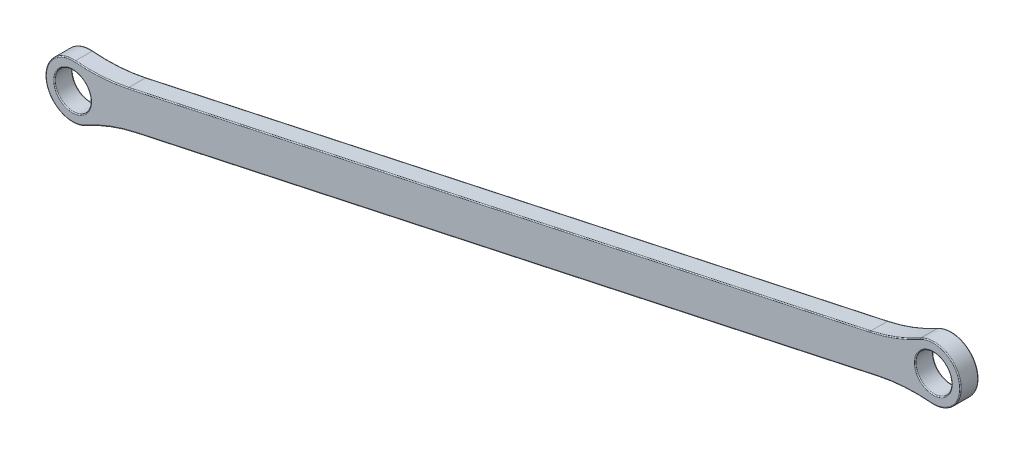
ISO-10303-21;
HEADER;
FILE_DESCRIPTION(('STEP AP214'),'2;1');
FILE_NAME('part.step','',(''),(''),'','','');
FILE_SCHEMA(('AUTOMOTIVE_DESIGN { 1 0 10303 214 1 1 1 1 }'));
ENDSEC;
DATA;
#1=APPLICATION_CONTEXT('core data for automotive mechanical design processes');
#2=APPLICATION_PROTOCOL_DEFINITION('international standard','automotive_design',2000,#1);
#3=PRODUCT_CONTEXT('',#1,'mechanical');
#4=PRODUCT('Part','Part','',(#3));
#5=PRODUCT_RELATED_PRODUCT_CATEGORY('part','',(#4));
#6=PRODUCT_DEFINITION_FORMATION('','',#4);
#7=PRODUCT_DEFINITION_CONTEXT('part definition',#1,'design');
#8=PRODUCT_DEFINITION('design','',#6,#7);
#9=PRODUCT_DEFINITION_SHAPE('','',#8);
#10=(LENGTH_UNIT() NAMED_UNIT(*) SI_UNIT(.MILLI.,.METRE.));
#11=(NAMED_UNIT(*) PLANE_ANGLE_UNIT() SI_UNIT($,.RADIAN.));
#12=(NAMED_UNIT(*) SI_UNIT($,.STERADIAN.) SOLID_ANGLE_UNIT());
#13=UNCERTAINTY_MEASURE_WITH_UNIT(LENGTH_MEASURE(1.E-05),#10,'distance_accuracy_value','');
#14=(GEOMETRIC_REPRESENTATION_CONTEXT(3) GLOBAL_UNCERTAINTY_ASSIGNED_CONTEXT((#13)) GLOBAL_UNIT_ASSIGNED_CONTEXT((#10,
#11,#12)) REPRESENTATION_CONTEXT('',''));
#15=CARTESIAN_POINT('',(0.,0.,0.));
#16=DIRECTION('',(0.,0.,1.));
#17=DIRECTION('',(1.,0.,0.));
#18=AXIS2_PLACEMENT_3D('',#15,#16,#17);
#19=CARTESIAN_POINT('',(-211.053707388335,198.392553374054,-3.));
#20=DIRECTION('',(0.,0.,1.));
#21=DIRECTION('',(1.,0.,0.));
#22=AXIS2_PLACEMENT_3D('',#19,#20,#21);
#23=CYLINDRICAL_SURFACE('',#22,4.49999999999999);
#24=DIRECTION('',(0.,0.,1.));
#25=VECTOR('',#24,1.);
#26=CARTESIAN_POINT('',(-210.679287399055,202.876949617878,-3.));
#27=LINE('',#26,#25);
#28=CARTESIAN_POINT('',(-210.679287399055,202.876949617878,-0.15));
#29=VERTEX_POINT('',#28);
#30=CARTESIAN_POINT('',(-210.679287399055,202.876949617878,-2.85));
#31=VERTEX_POINT('',#30);
#32=EDGE_CURVE('E261',#29,#31,#27,.F.);
#33=ORIENTED_EDGE('',*,*,#32,.T.);
#34=CARTESIAN_POINT('',(-211.053707388335,198.392553374054,-2.85));
#35=DIRECTION('',(0.,0.,1.));
#36=DIRECTION('',(1.,0.,0.));
#37=AXIS2_PLACEMENT_3D('',#34,#35,#36);
#38=CIRCLE('',#37,4.49999999999999);
#39=CARTESIAN_POINT('',(-208.862311578344,194.462186418673,-2.85));
#40=VERTEX_POINT('',#39);
#41=EDGE_CURVE('E220',#31,#40,#38,.T.);
#42=ORIENTED_EDGE('',*,*,#41,.T.);
#43=DIRECTION('',(0.,0.,1.));
#44=VECTOR('',#43,1.);
#45=CARTESIAN_POINT('',(-208.862311578344,194.462186418673,-3.));
#46=LINE('',#45,#44);
#47=CARTESIAN_POINT('',(-208.862311578344,194.462186418673,-0.15));
#48=VERTEX_POINT('',#47);
#49=EDGE_CURVE('E299',#40,#48,#46,.T.);
#50=ORIENTED_EDGE('',*,*,#49,.T.);
#51=CARTESIAN_POINT('',(-211.053707388335,198.392553374054,-0.15));
#52=DIRECTION('',(0.,0.,1.));
#53=DIRECTION('',(1.,0.,0.));
#54=AXIS2_PLACEMENT_3D('',#51,#52,#53);
#55=CIRCLE('',#54,4.49999999999999);
#56=EDGE_CURVE('E218',#48,#29,#55,.F.);
#57=ORIENTED_EDGE('',*,*,#56,.T.);
#58=EDGE_LOOP('',(#33,#42,#50,#57));
#59=FACE_BOUND('',#58,.T.);
#60=ADVANCED_FACE('F34',(#59),#23,.T.);
#61=CARTESIAN_POINT('',(-50.9651053118041,236.029168761039,-3.));
#62=DIRECTION('',(0.211062847860414,-0.977472492837037,0.));
#63=DIRECTION('',(0.977472492837037,0.211062847860414,0.));
#64=AXIS2_PLACEMENT_3D('',#61,#62,#63);
#65=PLANE('',#64);
#66=DIRECTION('',(0.,0.,1.));
#67=VECTOR('',#66,1.);
#68=CARTESIAN_POINT('',(-78.8115392082481,230.016367701153,-3.));
#69=LINE('',#68,#67);
#70=CARTESIAN_POINT('',(-78.8115392082481,230.016367701153,-0.15));
#71=VERTEX_POINT('',#70);
#72=CARTESIAN_POINT('',(-78.8115392082481,230.016367701153,-2.85));
#73=VERTEX_POINT('',#72);
#74=EDGE_CURVE('E318',#71,#73,#69,.F.);
#75=ORIENTED_EDGE('',*,*,#74,.T.);
#76=DIRECTION('',(0.977472492837037,0.211062847860414,0.));
#77=VECTOR('',#76,1.);
#78=CARTESIAN_POINT('',(-50.9651053118041,236.029168761039,-2.85));
#79=LINE('',#78,#77);
#80=CARTESIAN_POINT('',(-201.851268701377,203.448749791598,-2.85));
#81=VERTEX_POINT('',#80);
#82=EDGE_CURVE('E212',#73,#81,#79,.F.);
#83=ORIENTED_EDGE('',*,*,#82,.T.);
#84=DIRECTION('',(0.,0.,1.));
#85=VECTOR('',#84,1.);
#86=CARTESIAN_POINT('',(-201.851268701377,203.448749791598,-3.));
#87=LINE('',#86,#85);
#88=CARTESIAN_POINT('',(-201.851268701377,203.448749791598,-0.15));
#89=VERTEX_POINT('',#88);
#90=EDGE_CURVE('E321',#81,#89,#87,.T.);
#91=ORIENTED_EDGE('',*,*,#90,.T.);
#92=DIRECTION('',(0.977472492837037,0.211062847860414,0.));
#93=VECTOR('',#92,1.);
#94=CARTESIAN_POINT('',(-78.8115392082481,230.016367701153,-0.15));
#95=LINE('',#94,#93);
#96=EDGE_CURVE('E210',#89,#71,#95,.T.);
#97=ORIENTED_EDGE('',*,*,#96,.T.);
#98=EDGE_LOOP('',(#75,#83,#91,#97));
#99=FACE_BOUND('',#98,.T.);
#100=ADVANCED_FACE('F373',(#99),#65,.F.);
#101=CARTESIAN_POINT('',(-68.3427234341278,229.207729161674,-3.));
#102=DIRECTION('',(0.,0.,1.));
#103=DIRECTION('',(1.,0.,0.));
#104=AXIS2_PLACEMENT_3D('',#101,#102,#103);
#105=CYLINDRICAL_SURFACE('',#104,4.50000000000001);
#106=DIRECTION('',(0.,0.,1.));
#107=VECTOR('',#106,1.);
#108=CARTESIAN_POINT('',(-68.7171434234076,224.72333291785,-3.));
#109=LINE('',#108,#107);
#110=CARTESIAN_POINT('',(-68.7171434234076,224.72333291785,-0.15));
#111=VERTEX_POINT('',#110);
#112=CARTESIAN_POINT('',(-68.7171434234076,224.72333291785,-2.85));
#113=VERTEX_POINT('',#112);
#114=EDGE_CURVE('E315',#111,#113,#109,.F.);
#115=ORIENTED_EDGE('',*,*,#114,.T.);
#116=CARTESIAN_POINT('',(-68.3427234341278,229.207729161674,-2.85));
#117=DIRECTION('',(0.,0.,1.));
#118=DIRECTION('',(1.,0.,0.));
#119=AXIS2_PLACEMENT_3D('',#116,#117,#118);
#120=CIRCLE('',#119,4.50000000000001);
#121=CARTESIAN_POINT('',(-70.534119244119,233.138096117056,-2.85));
#122=VERTEX_POINT('',#121);
#123=EDGE_CURVE('E203',#113,#122,#120,.T.);
#124=ORIENTED_EDGE('',*,*,#123,.T.);
#125=DIRECTION('',(0.,0.,1.));
#126=VECTOR('',#125,1.);
#127=CARTESIAN_POINT('',(-70.534119244119,233.138096117056,-3.));
#128=LINE('',#127,#126);
#129=CARTESIAN_POINT('',(-70.534119244119,233.138096117056,-0.15));
#130=VERTEX_POINT('',#129);
#131=EDGE_CURVE('E312',#122,#130,#128,.T.);
#132=ORIENTED_EDGE('',*,*,#131,.T.);
#133=CARTESIAN_POINT('',(-68.3427234341278,229.207729161674,-0.15));
#134=DIRECTION('',(0.,0.,1.));
#135=DIRECTION('',(1.,0.,0.));
#136=AXIS2_PLACEMENT_3D('',#133,#134,#135);
#137=CIRCLE('',#136,4.50000000000001);
#138=EDGE_CURVE('E201',#130,#111,#137,.F.);
#139=ORIENTED_EDGE('',*,*,#138,.T.);
#140=EDGE_LOOP('',(#115,#124,#132,#139));
#141=FACE_BOUND('',#140,.T.);
#142=ADVANCED_FACE('F389',(#141),#105,.T.);
#143=CARTESIAN_POINT('',(-49.6987282246416,230.164333804017,-3.));
#144=DIRECTION('',(0.211062847860414,-0.977472492837037,0.));
#145=DIRECTION('',(0.977472492837037,0.211062847860414,0.));
#146=AXIS2_PLACEMENT_3D('',#143,#144,#145);
#147=PLANE('',#146);
#148=DIRECTION('',(0.,0.,-1.));
#149=VECTOR('',#148,1.);
#150=CARTESIAN_POINT('',(-200.584891614215,197.583914834575,-3.));
#151=LINE('',#150,#149);
#152=CARTESIAN_POINT('',(-200.584891614215,197.583914834575,-0.15));
#153=VERTEX_POINT('',#152);
#154=CARTESIAN_POINT('',(-200.584891614215,197.583914834575,-2.85));
#155=VERTEX_POINT('',#154);
#156=EDGE_CURVE('E301',#153,#155,#151,.T.);
#157=ORIENTED_EDGE('',*,*,#156,.T.);
#158=DIRECTION('',(0.977472492837037,0.211062847860414,0.));
#159=VECTOR('',#158,1.);
#160=CARTESIAN_POINT('',(-77.5451621210855,224.151532744131,-2.85));
#161=LINE('',#160,#159);
#162=CARTESIAN_POINT('',(-77.5451621210855,224.151532744131,-2.85));
#163=VERTEX_POINT('',#162);
#164=EDGE_CURVE('E195',#155,#163,#161,.T.);
#165=ORIENTED_EDGE('',*,*,#164,.T.);
#166=DIRECTION('',(0.,0.,-1.));
#167=VECTOR('',#166,1.);
#168=CARTESIAN_POINT('',(-77.5451621210855,224.151532744131,0.));
#169=LINE('',#168,#167);
#170=CARTESIAN_POINT('',(-77.5451621210855,224.151532744131,-0.15));
#171=VERTEX_POINT('',#170);
#172=EDGE_CURVE('E305',#163,#171,#169,.F.);
#173=ORIENTED_EDGE('',*,*,#172,.T.);
#174=DIRECTION('',(0.977472492837037,0.211062847860414,0.));
#175=VECTOR('',#174,1.);
#176=CARTESIAN_POINT('',(-49.6987282246416,230.164333804017,-0.15));
#177=LINE('',#176,#175);
#178=EDGE_CURVE('E193',#171,#153,#177,.F.);
#179=ORIENTED_EDGE('',*,*,#178,.T.);
#180=EDGE_LOOP('',(#157,#165,#173,#179));
#181=FACE_BOUND('',#180,.T.);
#182=ADVANCED_FACE('F344',(#181),#147,.T.);
#183=CARTESIAN_POINT('',(-68.3427234341278,229.207729161674,-3.));
#184=DIRECTION('',(0.,0.,1.));
#185=DIRECTION('',(1.,0.,0.));
#186=AXIS2_PLACEMENT_3D('',#183,#184,#185);
#187=CYLINDRICAL_SURFACE('',#186,3.00000000000002);
#188=CARTESIAN_POINT('',(-68.3427234341278,229.207729161674,-2.85));
#189=DIRECTION('',(0.,0.,1.));
#190=DIRECTION('',(1.,0.,0.));
#191=AXIS2_PLACEMENT_3D('',#188,#189,#190);
#192=CIRCLE('',#191,3.00000000000002);
#193=CARTESIAN_POINT('',(-65.3427234341278,229.207729161674,-2.85));
#194=VERTEX_POINT('',#193);
#195=EDGE_CURVE('E225',#194,#194,#192,.F.);
#196=ORIENTED_EDGE('',*,*,#195,.T.);
#197=EDGE_LOOP('',(#196));
#198=FACE_BOUND('',#197,.T.);
#199=CARTESIAN_POINT('',(-68.3427234341278,229.207729161674,-0.15));
#200=DIRECTION('',(0.,0.,1.));
#201=DIRECTION('',(1.,0.,0.));
#202=AXIS2_PLACEMENT_3D('',#199,#200,#201);
#203=CIRCLE('',#202,3.00000000000002);
#204=CARTESIAN_POINT('',(-65.3427234341278,229.207729161674,-0.15));
#205=VERTEX_POINT('',#204);
#206=EDGE_CURVE('E222',#205,#205,#203,.T.);
#207=ORIENTED_EDGE('',*,*,#206,.T.);
#208=EDGE_LOOP('',(#207));
#209=FACE_BOUND('',#208,.T.);
#210=ADVANCED_FACE('F396',(#198,#209),#187,.F.);
#211=CARTESIAN_POINT('',(-211.053707388335,198.392553374054,-3.));
#212=DIRECTION('',(0.,0.,1.));
#213=DIRECTION('',(1.,0.,0.));
#214=AXIS2_PLACEMENT_3D('',#211,#212,#213);
#215=CYLINDRICAL_SURFACE('',#214,3.00000000000001);
#216=CARTESIAN_POINT('',(-211.053707388335,198.392553374054,-2.85));
#217=DIRECTION('',(0.,0.,1.));
#218=DIRECTION('',(1.,0.,0.));
#219=AXIS2_PLACEMENT_3D('',#216,#217,#218);
#220=CIRCLE('',#219,3.00000000000001);
#221=CARTESIAN_POINT('',(-208.053707388335,198.392553374054,-2.85));
#222=VERTEX_POINT('',#221);
#223=EDGE_CURVE('E187',#222,#222,#220,.F.);
#224=ORIENTED_EDGE('',*,*,#223,.T.);
#225=EDGE_LOOP('',(#224));
#226=FACE_BOUND('',#225,.T.);
#227=CARTESIAN_POINT('',(-211.053707388335,198.392553374054,-0.15));
#228=DIRECTION('',(0.,0.,1.));
#229=DIRECTION('',(1.,0.,0.));
#230=AXIS2_PLACEMENT_3D('',#227,#228,#229);
#231=CIRCLE('',#230,3.00000000000001);
#232=CARTESIAN_POINT('',(-208.053707388335,198.392553374054,-0.15));
#233=VERTEX_POINT('',#232);
#234=EDGE_CURVE('E179',#233,#233,#231,.T.);
#235=ORIENTED_EDGE('',*,*,#234,.T.);
#236=EDGE_LOOP('',(#235));
#237=FACE_BOUND('',#236,.T.);
#238=ADVANCED_FACE('F406',(#226,#237),#215,.F.);
#239=CARTESIAN_POINT('',(0.,0.,-3.));
#240=DIRECTION('',(0.,0.,1.));
#241=DIRECTION('',(1.,0.,0.));
#242=AXIS2_PLACEMENT_3D('',#239,#240,#241);
#243=PLANE('',#242);
#244=CARTESIAN_POINT('',(-211.053707388335,198.392553374054,-3.));
#245=DIRECTION('',(0.,0.,1.));
#246=DIRECTION('',(1.,0.,0.));
#247=AXIS2_PLACEMENT_3D('',#244,#245,#246);
#248=CIRCLE('',#247,3.15000000000001);
#249=CARTESIAN_POINT('',(-207.903707388335,198.392553374054,-3.));
#250=VERTEX_POINT('',#249);
#251=EDGE_CURVE('E176',#250,#250,#248,.T.);
#252=ORIENTED_EDGE('',*,*,#251,.T.);
#253=EDGE_LOOP('',(#252));
#254=FACE_BOUND('',#253,.T.);
#255=DIRECTION('',(0.977472492837037,0.211062847860414,0.));
#256=VECTOR('',#255,1.);
#257=CARTESIAN_POINT('',(-200.616551041394,197.730535708501,-3.));
#258=LINE('',#257,#256);
#259=CARTESIAN_POINT('',(-77.5768215482645,224.298153618056,-3.));
#260=VERTEX_POINT('',#259);
#261=CARTESIAN_POINT('',(-200.616551041394,197.730535708501,-3.));
#262=VERTEX_POINT('',#261);
#263=EDGE_CURVE('E174',#260,#262,#258,.F.);
#264=ORIENTED_EDGE('',*,*,#263,.T.);
#265=CARTESIAN_POINT('',(-194.253006178403,168.259740049464,-3.));
#266=DIRECTION('',(0.,0.,1.));
#267=DIRECTION('',(1.,0.,0.));
#268=AXIS2_PLACEMENT_3D('',#265,#266,#267);
#269=CIRCLE('',#268,30.15);
#270=CARTESIAN_POINT('',(-208.935358105344,194.593198650519,-3.));
#271=VERTEX_POINT('',#270);
#272=EDGE_CURVE('E154',#262,#271,#269,.T.);
#273=ORIENTED_EDGE('',*,*,#272,.T.);
#274=CARTESIAN_POINT('',(-211.053707388335,198.392553374054,-3.));
#275=DIRECTION('',(0.,0.,1.));
#276=DIRECTION('',(1.,0.,0.));
#277=AXIS2_PLACEMENT_3D('',#274,#275,#276);
#278=CIRCLE('',#277,4.34999999999999);
#279=CARTESIAN_POINT('',(-210.691768065365,202.727469743084,-3.));
#280=VERTEX_POINT('',#279);
#281=EDGE_CURVE('E162',#271,#280,#278,.F.);
#282=ORIENTED_EDGE('',*,*,#281,.T.);
#283=CARTESIAN_POINT('',(-208.18315413719,232.772924576709,-3.));
#284=DIRECTION('',(0.,0.,1.));
#285=DIRECTION('',(1.,0.,0.));
#286=AXIS2_PLACEMENT_3D('',#283,#284,#285);
#287=CIRCLE('',#286,30.15);
#288=CARTESIAN_POINT('',(-201.819609274198,203.302128917672,-3.));
#289=VERTEX_POINT('',#288);
#290=EDGE_CURVE('E168',#280,#289,#287,.T.);
#291=ORIENTED_EDGE('',*,*,#290,.T.);
#292=DIRECTION('',(0.977472492837037,0.211062847860414,0.));
#293=VECTOR('',#292,1.);
#294=CARTESIAN_POINT('',(-50.9334458846251,235.882547887114,-3.));
#295=LINE('',#294,#293);
#296=CARTESIAN_POINT('',(-78.7798797810691,229.869746827227,-3.));
#297=VERTEX_POINT('',#296);
#298=EDGE_CURVE('E327',#289,#297,#295,.T.);
#299=ORIENTED_EDGE('',*,*,#298,.T.);
#300=CARTESIAN_POINT('',(-85.1434246440606,259.340542486264,-3.));
#301=DIRECTION('',(0.,0.,1.));
#302=DIRECTION('',(1.,0.,0.));
#303=AXIS2_PLACEMENT_3D('',#300,#301,#302);
#304=CIRCLE('',#303,30.15);
#305=CARTESIAN_POINT('',(-70.4610727171193,233.00708388521,-3.));
#306=VERTEX_POINT('',#305);
#307=EDGE_CURVE('E329',#297,#306,#304,.T.);
#308=ORIENTED_EDGE('',*,*,#307,.T.);
#309=CARTESIAN_POINT('',(-68.3427234341278,229.207729161674,-3.));
#310=DIRECTION('',(0.,0.,1.));
#311=DIRECTION('',(1.,0.,0.));
#312=AXIS2_PLACEMENT_3D('',#309,#310,#311);
#313=CIRCLE('',#312,4.35000000000001);
#314=CARTESIAN_POINT('',(-68.7046627570983,224.872812792644,-3.));
#315=VERTEX_POINT('',#314);
#316=EDGE_CURVE('E331',#306,#315,#313,.F.);
#317=ORIENTED_EDGE('',*,*,#316,.T.);
#318=CARTESIAN_POINT('',(-71.2132766852731,194.82735795902,-3.));
#319=DIRECTION('',(0.,0.,1.));
#320=DIRECTION('',(1.,0.,0.));
#321=AXIS2_PLACEMENT_3D('',#318,#319,#320);
#322=CIRCLE('',#321,30.15);
#323=EDGE_CURVE('E181',#315,#260,#322,.T.);
#324=ORIENTED_EDGE('',*,*,#323,.T.);
#325=EDGE_LOOP('',(#264,#273,#282,#291,#299,#308,#317,#324));
#326=FACE_BOUND('',#325,.T.);
#327=CARTESIAN_POINT('',(-68.3427234341278,229.207729161674,-3.));
#328=DIRECTION('',(0.,0.,1.));
#329=DIRECTION('',(1.,0.,0.));
#330=AXIS2_PLACEMENT_3D('',#327,#328,#329);
#331=CIRCLE('',#330,3.15000000000002);
#332=CARTESIAN_POINT('',(-65.1927234341278,229.207729161674,-3.));
#333=VERTEX_POINT('',#332);
#334=EDGE_CURVE('E169',#333,#333,#331,.T.);
#335=ORIENTED_EDGE('',*,*,#334,.T.);
#336=EDGE_LOOP('',(#335));
#337=FACE_BOUND('',#336,.T.);
#338=ADVANCED_FACE('F171',(#254,#326,#337),#243,.F.);
#339=CARTESIAN_POINT('',(0.,0.,0.));
#340=DIRECTION('',(0.,0.,1.));
#341=DIRECTION('',(1.,0.,0.));
#342=AXIS2_PLACEMENT_3D('',#339,#340,#341);
#343=PLANE('',#342);
#344=CARTESIAN_POINT('',(-211.053707388335,198.392553374054,0.));
#345=DIRECTION('',(0.,0.,1.));
#346=DIRECTION('',(1.,0.,0.));
#347=AXIS2_PLACEMENT_3D('',#344,#345,#346);
#348=CIRCLE('',#347,3.15000000000001);
#349=CARTESIAN_POINT('',(-207.903707388335,198.392553374054,0.));
#350=VERTEX_POINT('',#349);
#351=EDGE_CURVE('E11',#350,#350,#348,.F.);
#352=ORIENTED_EDGE('',*,*,#351,.T.);
#353=EDGE_LOOP('',(#352));
#354=FACE_BOUND('',#353,.T.);
#355=CARTESIAN_POINT('',(-68.3427234341278,229.207729161674,0.));
#356=DIRECTION('',(0.,0.,1.));
#357=DIRECTION('',(1.,0.,0.));
#358=AXIS2_PLACEMENT_3D('',#355,#356,#357);
#359=CIRCLE('',#358,4.35000000000001);
#360=CARTESIAN_POINT('',(-68.7046627570983,224.872812792644,0.));
#361=VERTEX_POINT('',#360);
#362=CARTESIAN_POINT('',(-70.4610727171193,233.00708388521,0.));
#363=VERTEX_POINT('',#362);
#364=EDGE_CURVE('E51',#361,#363,#359,.T.);
#365=ORIENTED_EDGE('',*,*,#364,.T.);
#366=CARTESIAN_POINT('',(-85.1434246440606,259.340542486264,0.));
#367=DIRECTION('',(0.,0.,1.));
#368=DIRECTION('',(1.,0.,0.));
#369=AXIS2_PLACEMENT_3D('',#366,#367,#368);
#370=CIRCLE('',#369,30.15);
#371=CARTESIAN_POINT('',(-78.7798797810691,229.869746827227,0.));
#372=VERTEX_POINT('',#371);
#373=EDGE_CURVE('E43',#363,#372,#370,.F.);
#374=ORIENTED_EDGE('',*,*,#373,.T.);
#375=DIRECTION('',(0.977472492837037,0.211062847860414,0.));
#376=VECTOR('',#375,1.);
#377=CARTESIAN_POINT('',(-201.819609274198,203.302128917672,0.));
#378=LINE('',#377,#376);
#379=CARTESIAN_POINT('',(-201.819609274198,203.302128917672,0.));
#380=VERTEX_POINT('',#379);
#381=EDGE_CURVE('E231',#372,#380,#378,.F.);
#382=ORIENTED_EDGE('',*,*,#381,.T.);
#383=CARTESIAN_POINT('',(-208.18315413719,232.772924576709,0.));
#384=DIRECTION('',(0.,0.,1.));
#385=DIRECTION('',(1.,0.,0.));
#386=AXIS2_PLACEMENT_3D('',#383,#384,#385);
#387=CIRCLE('',#386,30.15);
#388=CARTESIAN_POINT('',(-210.691768065365,202.727469743084,0.));
#389=VERTEX_POINT('',#388);
#390=EDGE_CURVE('E233',#380,#389,#387,.F.);
#391=ORIENTED_EDGE('',*,*,#390,.T.);
#392=CARTESIAN_POINT('',(-211.053707388335,198.392553374054,0.));
#393=DIRECTION('',(0.,0.,1.));
#394=DIRECTION('',(1.,0.,0.));
#395=AXIS2_PLACEMENT_3D('',#392,#393,#394);
#396=CIRCLE('',#395,4.34999999999999);
#397=CARTESIAN_POINT('',(-208.935358105344,194.593198650519,0.));
#398=VERTEX_POINT('',#397);
#399=EDGE_CURVE('E235',#389,#398,#396,.T.);
#400=ORIENTED_EDGE('',*,*,#399,.T.);
#401=CARTESIAN_POINT('',(-194.253006178403,168.259740049464,0.));
#402=DIRECTION('',(0.,0.,1.));
#403=DIRECTION('',(1.,0.,0.));
#404=AXIS2_PLACEMENT_3D('',#401,#402,#403);
#405=CIRCLE('',#404,30.15);
#406=CARTESIAN_POINT('',(-200.616551041394,197.730535708501,0.));
#407=VERTEX_POINT('',#406);
#408=EDGE_CURVE('E237',#398,#407,#405,.F.);
#409=ORIENTED_EDGE('',*,*,#408,.T.);
#410=DIRECTION('',(0.977472492837037,0.211062847860414,0.));
#411=VECTOR('',#410,1.);
#412=CARTESIAN_POINT('',(-49.7303876518207,230.310954677942,0.));
#413=LINE('',#412,#411);
#414=CARTESIAN_POINT('',(-77.5768215482645,224.298153618056,0.));
#415=VERTEX_POINT('',#414);
#416=EDGE_CURVE('E239',#407,#415,#413,.T.);
#417=ORIENTED_EDGE('',*,*,#416,.T.);
#418=CARTESIAN_POINT('',(-71.2132766852731,194.82735795902,0.));
#419=DIRECTION('',(0.,0.,1.));
#420=DIRECTION('',(1.,0.,0.));
#421=AXIS2_PLACEMENT_3D('',#418,#419,#420);
#422=CIRCLE('',#421,30.15);
#423=EDGE_CURVE('E56',#415,#361,#422,.F.);
#424=ORIENTED_EDGE('',*,*,#423,.T.);
#425=EDGE_LOOP('',(#365,#374,#382,#391,#400,#409,#417,#424));
#426=FACE_BOUND('',#425,.T.);
#427=CARTESIAN_POINT('',(-68.3427234341278,229.207729161674,0.));
#428=DIRECTION('',(0.,0.,1.));
#429=DIRECTION('',(1.,0.,0.));
#430=AXIS2_PLACEMENT_3D('',#427,#428,#429);
#431=CIRCLE('',#430,3.15000000000002);
#432=CARTESIAN_POINT('',(-65.1927234341278,229.207729161674,0.));
#433=VERTEX_POINT('',#432);
#434=EDGE_CURVE('E228',#433,#433,#431,.F.);
#435=ORIENTED_EDGE('',*,*,#434,.T.);
#436=EDGE_LOOP('',(#435));
#437=FACE_BOUND('',#436,.T.);
#438=ADVANCED_FACE('F360',(#354,#426,#437),#343,.T.);
#439=CARTESIAN_POINT('',(-194.253006178403,168.259740049464,-3.));
#440=DIRECTION('',(0.,0.,1.));
#441=DIRECTION('',(1.,0.,0.));
#442=AXIS2_PLACEMENT_3D('',#439,#440,#441);
#443=CYLINDRICAL_SURFACE('',#442,30.);
#444=ORIENTED_EDGE('',*,*,#49,.F.);
#445=CARTESIAN_POINT('',(-194.253006178403,168.259740049464,-2.85));
#446=DIRECTION('',(0.,0.,1.));
#447=DIRECTION('',(1.,0.,0.));
#448=AXIS2_PLACEMENT_3D('',#445,#446,#447);
#449=CIRCLE('',#448,30.);
#450=EDGE_CURVE('E156',#40,#155,#449,.F.);
#451=ORIENTED_EDGE('',*,*,#450,.T.);
#452=ORIENTED_EDGE('',*,*,#156,.F.);
#453=CARTESIAN_POINT('',(-194.253006178403,168.259740049464,-0.15));
#454=DIRECTION('',(0.,0.,1.));
#455=DIRECTION('',(1.,0.,0.));
#456=AXIS2_PLACEMENT_3D('',#453,#454,#455);
#457=CIRCLE('',#456,30.);
#458=EDGE_CURVE('E190',#153,#48,#457,.T.);
#459=ORIENTED_EDGE('',*,*,#458,.T.);
#460=EDGE_LOOP('',(#444,#451,#452,#459));
#461=FACE_BOUND('',#460,.T.);
#462=ADVANCED_FACE('F298',(#461),#443,.F.);
#463=CARTESIAN_POINT('',(-71.2132766852731,194.82735795902,-3.));
#464=DIRECTION('',(0.,0.,1.));
#465=DIRECTION('',(1.,0.,0.));
#466=AXIS2_PLACEMENT_3D('',#463,#464,#465);
#467=CYLINDRICAL_SURFACE('',#466,30.);
#468=ORIENTED_EDGE('',*,*,#172,.F.);
#469=CARTESIAN_POINT('',(-71.2132766852731,194.82735795902,-2.85));
#470=DIRECTION('',(0.,0.,1.));
#471=DIRECTION('',(1.,0.,0.));
#472=AXIS2_PLACEMENT_3D('',#469,#470,#471);
#473=CIRCLE('',#472,30.);
#474=EDGE_CURVE('E199',#163,#113,#473,.F.);
#475=ORIENTED_EDGE('',*,*,#474,.T.);
#476=ORIENTED_EDGE('',*,*,#114,.F.);
#477=CARTESIAN_POINT('',(-71.2132766852731,194.82735795902,-0.15));
#478=DIRECTION('',(0.,0.,1.));
#479=DIRECTION('',(1.,0.,0.));
#480=AXIS2_PLACEMENT_3D('',#477,#478,#479);
#481=CIRCLE('',#480,30.);
#482=EDGE_CURVE('E197',#111,#171,#481,.T.);
#483=ORIENTED_EDGE('',*,*,#482,.T.);
#484=EDGE_LOOP('',(#468,#475,#476,#483));
#485=FACE_BOUND('',#484,.T.);
#486=ADVANCED_FACE('F346',(#485),#467,.F.);
#487=CARTESIAN_POINT('',(-208.18315413719,232.772924576709,-3.));
#488=DIRECTION('',(0.,0.,1.));
#489=DIRECTION('',(1.,0.,0.));
#490=AXIS2_PLACEMENT_3D('',#487,#488,#489);
#491=CYLINDRICAL_SURFACE('',#490,30.);
#492=ORIENTED_EDGE('',*,*,#90,.F.);
#493=CARTESIAN_POINT('',(-208.18315413719,232.772924576709,-2.85));
#494=DIRECTION('',(0.,0.,1.));
#495=DIRECTION('',(1.,0.,0.));
#496=AXIS2_PLACEMENT_3D('',#493,#494,#495);
#497=CIRCLE('',#496,30.);
#498=EDGE_CURVE('E216',#81,#31,#497,.F.);
#499=ORIENTED_EDGE('',*,*,#498,.T.);
#500=ORIENTED_EDGE('',*,*,#32,.F.);
#501=CARTESIAN_POINT('',(-208.18315413719,232.772924576709,-0.15));
#502=DIRECTION('',(0.,0.,1.));
#503=DIRECTION('',(1.,0.,0.));
#504=AXIS2_PLACEMENT_3D('',#501,#502,#503);
#505=CIRCLE('',#504,30.);
#506=EDGE_CURVE('E214',#29,#89,#505,.T.);
#507=ORIENTED_EDGE('',*,*,#506,.T.);
#508=EDGE_LOOP('',(#492,#499,#500,#507));
#509=FACE_BOUND('',#508,.T.);
#510=ADVANCED_FACE('F412',(#509),#491,.F.);
#511=CARTESIAN_POINT('',(-85.1434246440606,259.340542486264,-3.));
#512=DIRECTION('',(0.,0.,1.));
#513=DIRECTION('',(1.,0.,0.));
#514=AXIS2_PLACEMENT_3D('',#511,#512,#513);
#515=CYLINDRICAL_SURFACE('',#514,30.);
#516=ORIENTED_EDGE('',*,*,#131,.F.);
#517=CARTESIAN_POINT('',(-85.1434246440606,259.340542486264,-2.85));
#518=DIRECTION('',(0.,0.,1.));
#519=DIRECTION('',(1.,0.,0.));
#520=AXIS2_PLACEMENT_3D('',#517,#518,#519);
#521=CIRCLE('',#520,30.);
#522=EDGE_CURVE('E208',#122,#73,#521,.F.);
#523=ORIENTED_EDGE('',*,*,#522,.T.);
#524=ORIENTED_EDGE('',*,*,#74,.F.);
#525=CARTESIAN_POINT('',(-85.1434246440606,259.340542486264,-0.15));
#526=DIRECTION('',(0.,0.,1.));
#527=DIRECTION('',(1.,0.,0.));
#528=AXIS2_PLACEMENT_3D('',#525,#526,#527);
#529=CIRCLE('',#528,30.);
#530=EDGE_CURVE('E205',#71,#130,#529,.T.);
#531=ORIENTED_EDGE('',*,*,#530,.T.);
#532=EDGE_LOOP('',(#516,#523,#524,#531));
#533=FACE_BOUND('',#532,.T.);
#534=ADVANCED_FACE('F378',(#533),#515,.F.);
#535=CARTESIAN_POINT('',(-211.053707388335,198.392553374054,-2.85));
#536=DIRECTION('',(0.,0.,1.));
#537=DIRECTION('',(1.,0.,0.));
#538=AXIS2_PLACEMENT_3D('',#535,#536,#537);
#539=TOROIDAL_SURFACE('',#538,3.15000000000001,0.15);
#540=ORIENTED_EDGE('',*,*,#223,.F.);
#541=EDGE_LOOP('',(#540));
#542=FACE_BOUND('',#541,.T.);
#543=ORIENTED_EDGE('',*,*,#251,.F.);
#544=EDGE_LOOP('',(#543));
#545=FACE_BOUND('',#544,.T.);
#546=ADVANCED_FACE('F418',(#542,#545),#539,.T.);
#547=CARTESIAN_POINT('',(-85.1434246440606,259.340542486264,-2.85));
#548=DIRECTION('',(0.,0.,1.));
#549=DIRECTION('',(1.,0.,0.));
#550=AXIS2_PLACEMENT_3D('',#547,#548,#549);
#551=TOROIDAL_SURFACE('',#550,30.15,0.15);
#552=CARTESIAN_POINT('',(-78.7798797810691,229.869746827227,-2.85));
#553=DIRECTION('',(-0.977472492837042,-0.211062847860394,0.));
#554=DIRECTION('',(0.211062847860394,-0.977472492837042,0.));
#555=AXIS2_PLACEMENT_3D('',#552,#553,#554);
#556=CIRCLE('',#555,0.15);
#557=EDGE_CURVE('E255',#73,#297,#556,.T.);
#558=ORIENTED_EDGE('',*,*,#557,.F.);
#559=ORIENTED_EDGE('',*,*,#522,.F.);
#560=CARTESIAN_POINT('',(-70.4610727171193,233.00708388521,-2.85));
#561=DIRECTION('',(0.873414878973613,0.486976846664714,0.));
#562=DIRECTION('',(-0.486976846664714,0.873414878973613,0.));
#563=AXIS2_PLACEMENT_3D('',#560,#561,#562);
#564=CIRCLE('',#563,0.15);
#565=EDGE_CURVE('E258',#306,#122,#564,.T.);
#566=ORIENTED_EDGE('',*,*,#565,.F.);
#567=ORIENTED_EDGE('',*,*,#307,.F.);
#568=EDGE_LOOP('',(#558,#559,#566,#567));
#569=FACE_BOUND('',#568,.T.);
#570=ADVANCED_FACE('F382',(#569),#551,.T.);
#571=CARTESIAN_POINT('',(-68.3427234341278,229.207729161674,-2.85));
#572=DIRECTION('',(0.,0.,1.));
#573=DIRECTION('',(1.,0.,0.));
#574=AXIS2_PLACEMENT_3D('',#571,#572,#573);
#575=TOROIDAL_SURFACE('',#574,4.35000000000001,0.15);
#576=ORIENTED_EDGE('',*,*,#565,.T.);
#577=ORIENTED_EDGE('',*,*,#123,.F.);
#578=CARTESIAN_POINT('',(-68.7046627570983,224.872812792644,-2.85));
#579=DIRECTION('',(-0.996532498627679,0.0832044420621595,0.));
#580=DIRECTION('',(-0.0832044420621595,-0.996532498627679,0.));
#581=AXIS2_PLACEMENT_3D('',#578,#579,#580);
#582=CIRCLE('',#581,0.15);
#583=EDGE_CURVE('E252',#315,#113,#582,.T.);
#584=ORIENTED_EDGE('',*,*,#583,.F.);
#585=ORIENTED_EDGE('',*,*,#316,.F.);
#586=EDGE_LOOP('',(#576,#577,#584,#585));
#587=FACE_BOUND('',#586,.T.);
#588=ADVANCED_FACE('F387',(#587),#575,.T.);
#589=CARTESIAN_POINT('',(-50.9334458846251,235.882547887114,-2.85));
#590=DIRECTION('',(0.977472492837037,0.211062847860414,0.));
#591=DIRECTION('',(-0.211062847860414,0.977472492837037,0.));
#592=AXIS2_PLACEMENT_3D('',#589,#590,#591);
#593=CYLINDRICAL_SURFACE('',#592,0.15);
#594=ORIENTED_EDGE('',*,*,#557,.T.);
#595=ORIENTED_EDGE('',*,*,#298,.F.);
#596=CARTESIAN_POINT('',(-201.819609274198,203.302128917672,-2.85));
#597=DIRECTION('',(-0.977472492837042,-0.211062847860394,0.));
#598=DIRECTION('',(0.211062847860394,-0.977472492837042,0.));
#599=AXIS2_PLACEMENT_3D('',#596,#597,#598);
#600=CIRCLE('',#599,0.15);
#601=EDGE_CURVE('E249',#81,#289,#600,.T.);
#602=ORIENTED_EDGE('',*,*,#601,.F.);
#603=ORIENTED_EDGE('',*,*,#82,.F.);
#604=EDGE_LOOP('',(#594,#595,#602,#603));
#605=FACE_BOUND('',#604,.T.);
#606=ADVANCED_FACE('F435',(#605),#593,.T.);
#607=CARTESIAN_POINT('',(-71.2132766852731,194.82735795902,-2.85));
#608=DIRECTION('',(0.,0.,1.));
#609=DIRECTION('',(1.,0.,0.));
#610=AXIS2_PLACEMENT_3D('',#607,#608,#609);
#611=TOROIDAL_SURFACE('',#610,30.15,0.15);
#612=ORIENTED_EDGE('',*,*,#583,.T.);
#613=ORIENTED_EDGE('',*,*,#474,.F.);
#614=CARTESIAN_POINT('',(-77.5768215482645,224.298153618056,-2.85));
#615=DIRECTION('',(-0.977472492837042,-0.211062847860394,0.));
#616=DIRECTION('',(0.211062847860394,-0.977472492837042,0.));
#617=AXIS2_PLACEMENT_3D('',#614,#615,#616);
#618=CIRCLE('',#617,0.15);
#619=EDGE_CURVE('E246',#260,#163,#618,.T.);
#620=ORIENTED_EDGE('',*,*,#619,.F.);
#621=ORIENTED_EDGE('',*,*,#323,.F.);
#622=EDGE_LOOP('',(#612,#613,#620,#621));
#623=FACE_BOUND('',#622,.T.);
#624=ADVANCED_FACE('F338',(#623),#611,.T.);
#625=CARTESIAN_POINT('',(-208.18315413719,232.772924576709,-2.85));
#626=DIRECTION('',(0.,0.,1.));
#627=DIRECTION('',(1.,0.,0.));
#628=AXIS2_PLACEMENT_3D('',#625,#626,#627);
#629=TOROIDAL_SURFACE('',#628,30.15,0.15);
#630=ORIENTED_EDGE('',*,*,#601,.T.);
#631=ORIENTED_EDGE('',*,*,#290,.F.);
#632=CARTESIAN_POINT('',(-210.691768065365,202.727469743084,-2.85));
#633=DIRECTION('',(-0.99653249862768,0.0832044420621441,0.));
#634=DIRECTION('',(-0.0832044420621441,-0.99653249862768,0.));
#635=AXIS2_PLACEMENT_3D('',#632,#633,#634);
#636=CIRCLE('',#635,0.15);
#637=EDGE_CURVE('E165',#31,#280,#636,.T.);
#638=ORIENTED_EDGE('',*,*,#637,.F.);
#639=ORIENTED_EDGE('',*,*,#498,.F.);
#640=EDGE_LOOP('',(#630,#631,#638,#639));
#641=FACE_BOUND('',#640,.T.);
#642=ADVANCED_FACE('F429',(#641),#629,.T.);
#643=CARTESIAN_POINT('',(-49.7303876518207,230.310954677943,-2.85));
#644=DIRECTION('',(-0.977472492837037,-0.211062847860414,0.));
#645=DIRECTION('',(0.211062847860414,-0.977472492837037,0.));
#646=AXIS2_PLACEMENT_3D('',#643,#644,#645);
#647=CYLINDRICAL_SURFACE('',#646,0.15);
#648=ORIENTED_EDGE('',*,*,#619,.T.);
#649=ORIENTED_EDGE('',*,*,#164,.F.);
#650=CARTESIAN_POINT('',(-200.616551041394,197.730535708501,-2.85));
#651=DIRECTION('',(-0.977472492837042,-0.211062847860394,0.));
#652=DIRECTION('',(0.211062847860394,-0.977472492837042,0.));
#653=AXIS2_PLACEMENT_3D('',#650,#651,#652);
#654=CIRCLE('',#653,0.15);
#655=EDGE_CURVE('E159',#262,#155,#654,.T.);
#656=ORIENTED_EDGE('',*,*,#655,.F.);
#657=ORIENTED_EDGE('',*,*,#263,.F.);
#658=EDGE_LOOP('',(#648,#649,#656,#657));
#659=FACE_BOUND('',#658,.T.);
#660=ADVANCED_FACE('F341',(#659),#647,.T.);
#661=CARTESIAN_POINT('',(-211.053707388335,198.392553374054,-2.85));
#662=DIRECTION('',(0.,0.,1.));
#663=DIRECTION('',(1.,0.,0.));
#664=AXIS2_PLACEMENT_3D('',#661,#662,#663);
#665=TOROIDAL_SURFACE('',#664,4.34999999999999,0.15);
#666=ORIENTED_EDGE('',*,*,#637,.T.);
#667=ORIENTED_EDGE('',*,*,#281,.F.);
#668=CARTESIAN_POINT('',(-208.935358105344,194.593198650519,-2.85));
#669=DIRECTION('',(0.873414878973613,0.486976846664714,0.));
#670=DIRECTION('',(-0.486976846664714,0.873414878973613,0.));
#671=AXIS2_PLACEMENT_3D('',#668,#669,#670);
#672=CIRCLE('',#671,0.15);
#673=EDGE_CURVE('E150',#40,#271,#672,.T.);
#674=ORIENTED_EDGE('',*,*,#673,.F.);
#675=ORIENTED_EDGE('',*,*,#41,.F.);
#676=EDGE_LOOP('',(#666,#667,#674,#675));
#677=FACE_BOUND('',#676,.T.);
#678=ADVANCED_FACE('F163',(#677),#665,.T.);
#679=CARTESIAN_POINT('',(-194.253006178403,168.259740049464,-2.85));
#680=DIRECTION('',(0.,0.,1.));
#681=DIRECTION('',(1.,0.,0.));
#682=AXIS2_PLACEMENT_3D('',#679,#680,#681);
#683=TOROIDAL_SURFACE('',#682,30.15,0.15);
#684=ORIENTED_EDGE('',*,*,#655,.T.);
#685=ORIENTED_EDGE('',*,*,#450,.F.);
#686=ORIENTED_EDGE('',*,*,#673,.T.);
#687=ORIENTED_EDGE('',*,*,#272,.F.);
#688=EDGE_LOOP('',(#684,#685,#686,#687));
#689=FACE_BOUND('',#688,.T.);
#690=ADVANCED_FACE('F152',(#689),#683,.T.);
#691=CARTESIAN_POINT('',(-68.3427234341278,229.207729161674,-2.85));
#692=DIRECTION('',(0.,0.,1.));
#693=DIRECTION('',(1.,0.,0.));
#694=AXIS2_PLACEMENT_3D('',#691,#692,#693);
#695=TOROIDAL_SURFACE('',#694,3.15000000000002,0.15);
#696=ORIENTED_EDGE('',*,*,#195,.F.);
#697=EDGE_LOOP('',(#696));
#698=FACE_BOUND('',#697,.T.);
#699=ORIENTED_EDGE('',*,*,#334,.F.);
#700=EDGE_LOOP('',(#699));
#701=FACE_BOUND('',#700,.T.);
#702=ADVANCED_FACE('F424',(#698,#701),#695,.T.);
#703=CARTESIAN_POINT('',(-211.053707388335,198.392553374054,-0.15));
#704=DIRECTION('',(0.,0.,1.));
#705=DIRECTION('',(1.,0.,0.));
#706=AXIS2_PLACEMENT_3D('',#703,#704,#705);
#707=TOROIDAL_SURFACE('',#706,3.15000000000001,0.15);
#708=ORIENTED_EDGE('',*,*,#351,.F.);
#709=EDGE_LOOP('',(#708));
#710=FACE_BOUND('',#709,.T.);
#711=ORIENTED_EDGE('',*,*,#234,.F.);
#712=EDGE_LOOP('',(#711));
#713=FACE_BOUND('',#712,.T.);
#714=ADVANCED_FACE('F445',(#710,#713),#707,.T.);
#715=CARTESIAN_POINT('',(-194.253006178403,168.259740049464,-0.15));
#716=DIRECTION('',(0.,0.,1.));
#717=DIRECTION('',(1.,0.,0.));
#718=AXIS2_PLACEMENT_3D('',#715,#716,#717);
#719=TOROIDAL_SURFACE('',#718,30.15,0.15);
#720=CARTESIAN_POINT('',(-208.935358105344,194.593198650519,-0.15));
#721=DIRECTION('',(-0.873414878973569,-0.486976846664793,0.));
#722=DIRECTION('',(0.486976846664793,-0.87341487897357,0.));
#723=AXIS2_PLACEMENT_3D('',#720,#721,#722);
#724=CIRCLE('',#723,0.15);
#725=EDGE_CURVE('E277',#48,#398,#724,.T.);
#726=ORIENTED_EDGE('',*,*,#725,.F.);
#727=ORIENTED_EDGE('',*,*,#458,.F.);
#728=CARTESIAN_POINT('',(-200.616551041394,197.730535708501,-0.15));
#729=DIRECTION('',(0.977472492837041,0.211062847860394,0.));
#730=DIRECTION('',(-0.211062847860394,0.977472492837041,0.));
#731=AXIS2_PLACEMENT_3D('',#728,#729,#730);
#732=CIRCLE('',#731,0.15);
#733=EDGE_CURVE('E38',#407,#153,#732,.T.);
#734=ORIENTED_EDGE('',*,*,#733,.F.);
#735=ORIENTED_EDGE('',*,*,#408,.F.);
#736=EDGE_LOOP('',(#726,#727,#734,#735));
#737=FACE_BOUND('',#736,.T.);
#738=ADVANCED_FACE('F293',(#737),#719,.T.);
#739=CARTESIAN_POINT('',(-49.7303876518207,230.310954677943,-0.15));
#740=DIRECTION('',(0.977472492837037,0.211062847860414,0.));
#741=DIRECTION('',(-0.211062847860414,0.977472492837037,0.));
#742=AXIS2_PLACEMENT_3D('',#739,#740,#741);
#743=CYLINDRICAL_SURFACE('',#742,0.15);
#744=ORIENTED_EDGE('',*,*,#733,.T.);
#745=ORIENTED_EDGE('',*,*,#178,.F.);
#746=CARTESIAN_POINT('',(-77.5768215482645,224.298153618056,-0.15));
#747=DIRECTION('',(0.977472492837041,0.211062847860394,0.));
#748=DIRECTION('',(-0.211062847860394,0.977472492837041,0.));
#749=AXIS2_PLACEMENT_3D('',#746,#747,#748);
#750=CIRCLE('',#749,0.15);
#751=EDGE_CURVE('E275',#415,#171,#750,.T.);
#752=ORIENTED_EDGE('',*,*,#751,.F.);
#753=ORIENTED_EDGE('',*,*,#416,.F.);
#754=EDGE_LOOP('',(#744,#745,#752,#753));
#755=FACE_BOUND('',#754,.T.);
#756=ADVANCED_FACE('F288',(#755),#743,.T.);
#757=CARTESIAN_POINT('',(-211.053707388335,198.392553374054,-0.15));
#758=DIRECTION('',(0.,0.,1.));
#759=DIRECTION('',(1.,0.,0.));
#760=AXIS2_PLACEMENT_3D('',#757,#758,#759);
#761=TOROIDAL_SURFACE('',#760,4.34999999999999,0.15);
#762=ORIENTED_EDGE('',*,*,#725,.T.);
#763=ORIENTED_EDGE('',*,*,#399,.F.);
#764=CARTESIAN_POINT('',(-210.691768065365,202.727469743084,-0.15));
#765=DIRECTION('',(0.99653249862768,-0.0832044420621441,0.));
#766=DIRECTION('',(0.0832044420621441,0.99653249862768,0.));
#767=AXIS2_PLACEMENT_3D('',#764,#765,#766);
#768=CIRCLE('',#767,0.15);
#769=EDGE_CURVE('E272',#29,#389,#768,.T.);
#770=ORIENTED_EDGE('',*,*,#769,.F.);
#771=ORIENTED_EDGE('',*,*,#56,.F.);
#772=EDGE_LOOP('',(#762,#763,#770,#771));
#773=FACE_BOUND('',#772,.T.);
#774=ADVANCED_FACE('F460',(#773),#761,.T.);
#775=CARTESIAN_POINT('',(-71.2132766852731,194.82735795902,-0.15));
#776=DIRECTION('',(0.,0.,1.));
#777=DIRECTION('',(1.,0.,0.));
#778=AXIS2_PLACEMENT_3D('',#775,#776,#777);
#779=TOROIDAL_SURFACE('',#778,30.15,0.15);
#780=ORIENTED_EDGE('',*,*,#751,.T.);
#781=ORIENTED_EDGE('',*,*,#482,.F.);
#782=CARTESIAN_POINT('',(-68.7046627570983,224.872812792644,-0.15));
#783=DIRECTION('',(0.996532498627679,-0.0832044420621595,0.));
#784=DIRECTION('',(0.0832044420621595,0.996532498627679,0.));
#785=AXIS2_PLACEMENT_3D('',#782,#783,#784);
#786=CIRCLE('',#785,0.15);
#787=EDGE_CURVE('E269',#361,#111,#786,.T.);
#788=ORIENTED_EDGE('',*,*,#787,.F.);
#789=ORIENTED_EDGE('',*,*,#423,.F.);
#790=EDGE_LOOP('',(#780,#781,#788,#789));
#791=FACE_BOUND('',#790,.T.);
#792=ADVANCED_FACE('F350',(#791),#779,.T.);
#793=CARTESIAN_POINT('',(-208.18315413719,232.772924576709,-0.15));
#794=DIRECTION('',(0.,0.,1.));
#795=DIRECTION('',(1.,0.,0.));
#796=AXIS2_PLACEMENT_3D('',#793,#794,#795);
#797=TOROIDAL_SURFACE('',#796,30.15,0.15);
#798=ORIENTED_EDGE('',*,*,#769,.T.);
#799=ORIENTED_EDGE('',*,*,#390,.F.);
#800=CARTESIAN_POINT('',(-201.819609274198,203.302128917672,-0.15));
#801=DIRECTION('',(0.977472492837042,0.211062847860394,0.));
#802=DIRECTION('',(-0.211062847860394,0.977472492837042,0.));
#803=AXIS2_PLACEMENT_3D('',#800,#801,#802);
#804=CIRCLE('',#803,0.15);
#805=EDGE_CURVE('E266',#89,#380,#804,.T.);
#806=ORIENTED_EDGE('',*,*,#805,.F.);
#807=ORIENTED_EDGE('',*,*,#506,.F.);
#808=EDGE_LOOP('',(#798,#799,#806,#807));
#809=FACE_BOUND('',#808,.T.);
#810=ADVANCED_FACE('F366',(#809),#797,.T.);
#811=CARTESIAN_POINT('',(-68.3427234341278,229.207729161674,-0.15));
#812=DIRECTION('',(0.,0.,1.));
#813=DIRECTION('',(1.,0.,0.));
#814=AXIS2_PLACEMENT_3D('',#811,#812,#813);
#815=TOROIDAL_SURFACE('',#814,4.35000000000001,0.15);
#816=ORIENTED_EDGE('',*,*,#787,.T.);
#817=ORIENTED_EDGE('',*,*,#138,.F.);
#818=CARTESIAN_POINT('',(-70.4610727171193,233.00708388521,-0.15));
#819=DIRECTION('',(-0.873414878973613,-0.486976846664714,0.));
#820=DIRECTION('',(0.486976846664714,-0.873414878973613,0.));
#821=AXIS2_PLACEMENT_3D('',#818,#819,#820);
#822=CIRCLE('',#821,0.15);
#823=EDGE_CURVE('E264',#363,#130,#822,.T.);
#824=ORIENTED_EDGE('',*,*,#823,.F.);
#825=ORIENTED_EDGE('',*,*,#364,.F.);
#826=EDGE_LOOP('',(#816,#817,#824,#825));
#827=FACE_BOUND('',#826,.T.);
#828=ADVANCED_FACE('F353',(#827),#815,.T.);
#829=CARTESIAN_POINT('',(-50.9334458846251,235.882547887114,-0.15));
#830=DIRECTION('',(-0.977472492837037,-0.211062847860414,0.));
#831=DIRECTION('',(0.211062847860414,-0.977472492837037,0.));
#832=AXIS2_PLACEMENT_3D('',#829,#830,#831);
#833=CYLINDRICAL_SURFACE('',#832,0.15);
#834=ORIENTED_EDGE('',*,*,#805,.T.);
#835=ORIENTED_EDGE('',*,*,#381,.F.);
#836=CARTESIAN_POINT('',(-78.7798797810691,229.869746827227,-0.15));
#837=DIRECTION('',(0.977472492837042,0.211062847860394,0.));
#838=DIRECTION('',(-0.211062847860394,0.977472492837042,0.));
#839=AXIS2_PLACEMENT_3D('',#836,#837,#838);
#840=CIRCLE('',#839,0.15);
#841=EDGE_CURVE('E262',#71,#372,#840,.T.);
#842=ORIENTED_EDGE('',*,*,#841,.F.);
#843=ORIENTED_EDGE('',*,*,#96,.F.);
#844=EDGE_LOOP('',(#834,#835,#842,#843));
#845=FACE_BOUND('',#844,.T.);
#846=ADVANCED_FACE('F370',(#845),#833,.T.);
#847=CARTESIAN_POINT('',(-85.1434246440606,259.340542486264,-0.15));
#848=DIRECTION('',(0.,0.,1.));
#849=DIRECTION('',(1.,0.,0.));
#850=AXIS2_PLACEMENT_3D('',#847,#848,#849);
#851=TOROIDAL_SURFACE('',#850,30.15,0.15);
#852=ORIENTED_EDGE('',*,*,#823,.T.);
#853=ORIENTED_EDGE('',*,*,#530,.F.);
#854=ORIENTED_EDGE('',*,*,#841,.T.);
#855=ORIENTED_EDGE('',*,*,#373,.F.);
#856=EDGE_LOOP('',(#852,#853,#854,#855));
#857=FACE_BOUND('',#856,.T.);
#858=ADVANCED_FACE('F357',(#857),#851,.T.);
#859=CARTESIAN_POINT('',(-68.3427234341278,229.207729161674,-0.15));
#860=DIRECTION('',(0.,0.,1.));
#861=DIRECTION('',(1.,0.,0.));
#862=AXIS2_PLACEMENT_3D('',#859,#860,#861);
#863=TOROIDAL_SURFACE('',#862,3.15000000000002,0.15);
#864=ORIENTED_EDGE('',*,*,#434,.F.);
#865=EDGE_LOOP('',(#864));
#866=FACE_BOUND('',#865,.T.);
#867=ORIENTED_EDGE('',*,*,#206,.F.);
#868=EDGE_LOOP('',(#867));
#869=FACE_BOUND('',#868,.T.);
#870=ADVANCED_FACE('F36',(#866,#869),#863,.T.);
#871=CLOSED_SHELL('',(#60,#100,#142,#182,#210,#238,#338,#438,#462,#486,#510,#534,#546,#570,#588,
#606,#624,#642,#660,#678,#690,#702,#714,#738,#756,#774,#792,#810,#828,#846,#858,#870));
#872=MANIFOLD_SOLID_BREP('B2',#871);
#873=ADVANCED_BREP_SHAPE_REPRESENTATION('',(#18,#872),#14);
#874=SHAPE_DEFINITION_REPRESENTATION(#9,#873);
ENDSEC;
END-ISO-10303-21;
